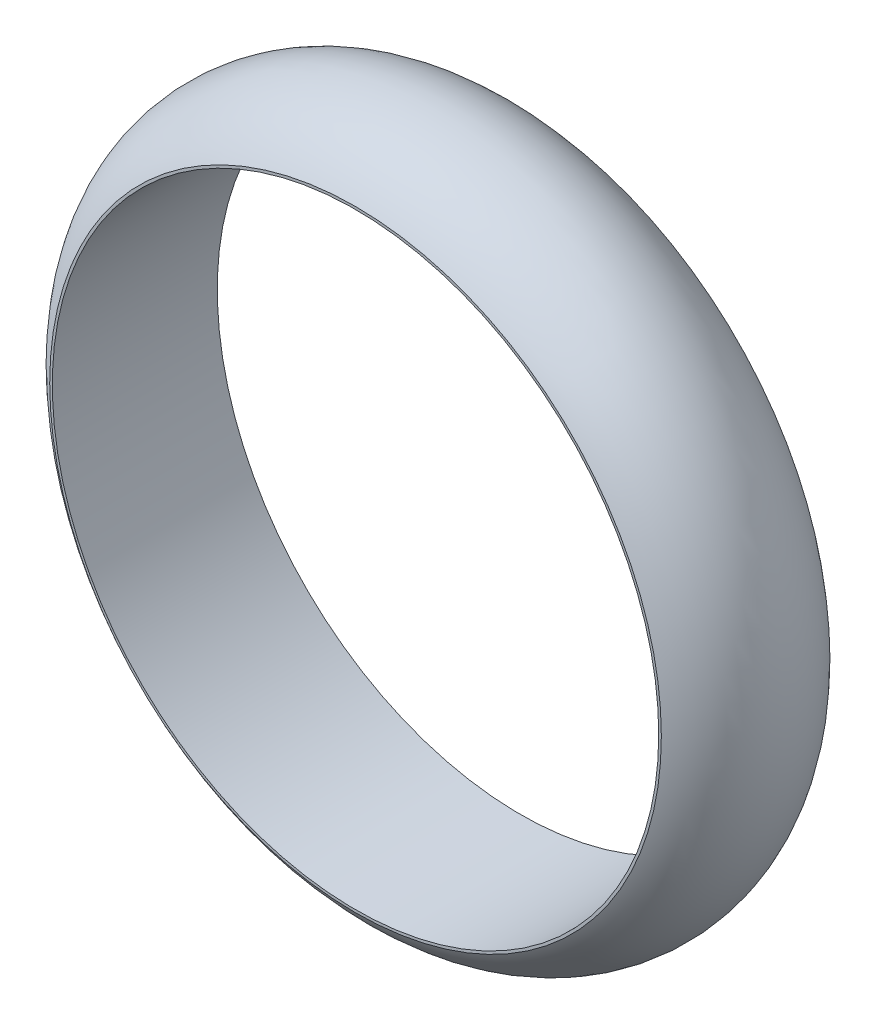
ISO-10303-21;
HEADER;
FILE_DESCRIPTION(('STEP AP214'),'2;1');
FILE_NAME('part.step','',(''),(''),'','','');
FILE_SCHEMA(('AUTOMOTIVE_DESIGN { 1 0 10303 214 1 1 1 1 }'));
ENDSEC;
DATA;
#1=APPLICATION_CONTEXT('core data for automotive mechanical design processes');
#2=APPLICATION_PROTOCOL_DEFINITION('international standard','automotive_design',2000,#1);
#3=PRODUCT_CONTEXT('',#1,'mechanical');
#4=PRODUCT('Part','Part','',(#3));
#5=PRODUCT_RELATED_PRODUCT_CATEGORY('part','',(#4));
#6=PRODUCT_DEFINITION_FORMATION('','',#4);
#7=PRODUCT_DEFINITION_CONTEXT('part definition',#1,'design');
#8=PRODUCT_DEFINITION('design','',#6,#7);
#9=PRODUCT_DEFINITION_SHAPE('','',#8);
#10=(LENGTH_UNIT() NAMED_UNIT(*) SI_UNIT(.MILLI.,.METRE.));
#11=(NAMED_UNIT(*) PLANE_ANGLE_UNIT() SI_UNIT($,.RADIAN.));
#12=(NAMED_UNIT(*) SI_UNIT($,.STERADIAN.) SOLID_ANGLE_UNIT());
#13=UNCERTAINTY_MEASURE_WITH_UNIT(LENGTH_MEASURE(1.E-05),#10,'distance_accuracy_value','');
#14=(GEOMETRIC_REPRESENTATION_CONTEXT(3) GLOBAL_UNCERTAINTY_ASSIGNED_CONTEXT((#13)) GLOBAL_UNIT_ASSIGNED_CONTEXT((#10,
#11,#12)) REPRESENTATION_CONTEXT('',''));
#15=CARTESIAN_POINT('',(0.,0.,0.));
#16=DIRECTION('',(0.,0.,1.));
#17=DIRECTION('',(1.,0.,0.));
#18=AXIS2_PLACEMENT_3D('',#15,#16,#17);
#19=CARTESIAN_POINT('',(0.,0.,0.));
#20=DIRECTION('',(0.,0.,1.));
#21=DIRECTION('',(1.,0.,0.));
#22=AXIS2_PLACEMENT_3D('',#19,#20,#21);
#23=PLANE('',#22);
#24=CARTESIAN_POINT('',(0.,0.,0.));
#25=DIRECTION('',(0.,0.,1.));
#26=DIRECTION('',(1.,0.,0.));
#27=AXIS2_PLACEMENT_3D('',#24,#25,#26);
#28=CIRCLE('',#27,62.5);
#29=CARTESIAN_POINT('',(62.5,0.,0.));
#30=VERTEX_POINT('',#29);
#31=EDGE_CURVE('E37',#30,#30,#28,.T.);
#32=ORIENTED_EDGE('',*,*,#31,.T.);
#33=EDGE_LOOP('',(#32));
#34=FACE_BOUND('',#33,.T.);
#35=CARTESIAN_POINT('',(0.,0.,-1.96440709261044E-13));
#36=DIRECTION('',(0.,0.,-1.));
#37=DIRECTION('',(0.,1.,0.));
#38=AXIS2_PLACEMENT_3D('',#35,#36,#37);
#39=CIRCLE('',#38,63.0356537528528);
#40=CARTESIAN_POINT('',(0.,63.0356537528528,-1.84861247520955E-13));
#41=VERTEX_POINT('',#40);
#42=EDGE_CURVE('E48',#41,#41,#39,.T.);
#43=ORIENTED_EDGE('',*,*,#42,.T.);
#44=EDGE_LOOP('',(#43));
#45=FACE_BOUND('',#44,.T.);
#46=ADVANCED_FACE('F34',(#34,#45),#23,.F.);
#47=CARTESIAN_POINT('',(0.,0.,34.));
#48=DIRECTION('',(0.,0.,1.));
#49=DIRECTION('',(1.,0.,0.));
#50=AXIS2_PLACEMENT_3D('',#47,#48,#49);
#51=PLANE('',#50);
#52=CARTESIAN_POINT('',(0.,0.,34.));
#53=DIRECTION('',(0.,0.,-1.));
#54=DIRECTION('',(0.,1.,0.));
#55=AXIS2_PLACEMENT_3D('',#52,#53,#54);
#56=CIRCLE('',#55,63.0356537528528);
#57=CARTESIAN_POINT('',(0.,63.0356537528528,34.));
#58=VERTEX_POINT('',#57);
#59=EDGE_CURVE('E44',#58,#58,#56,.T.);
#60=ORIENTED_EDGE('',*,*,#59,.F.);
#61=EDGE_LOOP('',(#60));
#62=FACE_BOUND('',#61,.T.);
#63=CARTESIAN_POINT('',(0.,0.,34.));
#64=DIRECTION('',(0.,0.,1.));
#65=DIRECTION('',(1.,0.,0.));
#66=AXIS2_PLACEMENT_3D('',#63,#64,#65);
#67=CIRCLE('',#66,62.5);
#68=CARTESIAN_POINT('',(62.5,0.,34.));
#69=VERTEX_POINT('',#68);
#70=EDGE_CURVE('E10',#69,#69,#67,.T.);
#71=ORIENTED_EDGE('',*,*,#70,.F.);
#72=EDGE_LOOP('',(#71));
#73=FACE_BOUND('',#72,.T.);
#74=ADVANCED_FACE('F61',(#62,#73),#51,.T.);
#75=CARTESIAN_POINT('',(0.,0.,34.));
#76=DIRECTION('',(0.,0.,-1.));
#77=DIRECTION('',(-1.,0.,0.));
#78=AXIS2_PLACEMENT_3D('',#75,#76,#77);
#79=CYLINDRICAL_SURFACE('',#78,62.5);
#80=ORIENTED_EDGE('',*,*,#70,.T.);
#81=EDGE_LOOP('',(#80));
#82=FACE_BOUND('',#81,.T.);
#83=ORIENTED_EDGE('',*,*,#31,.F.);
#84=EDGE_LOOP('',(#83));
#85=FACE_BOUND('',#84,.T.);
#86=ADVANCED_FACE('F55',(#82,#85),#79,.F.);
#87=CARTESIAN_POINT('',(0.,0.,17.));
#88=DIRECTION('',(0.,0.,-1.));
#89=DIRECTION('',(0.,1.,0.));
#90=AXIS2_PLACEMENT_3D('',#87,#88,#89);
#91=TOROIDAL_SURFACE('',#90,52.5,20.);
#92=ORIENTED_EDGE('',*,*,#59,.T.);
#93=EDGE_LOOP('',(#92));
#94=FACE_BOUND('',#93,.T.);
#95=ORIENTED_EDGE('',*,*,#42,.F.);
#96=EDGE_LOOP('',(#95));
#97=FACE_BOUND('',#96,.T.);
#98=ADVANCED_FACE('F53',(#94,#97),#91,.T.);
#99=CLOSED_SHELL('',(#46,#74,#86,#98));
#100=MANIFOLD_SOLID_BREP('B2',#99);
#101=ADVANCED_BREP_SHAPE_REPRESENTATION('',(#18,#100),#14);
#102=SHAPE_DEFINITION_REPRESENTATION(#9,#101);
ENDSEC;
END-ISO-10303-21;
